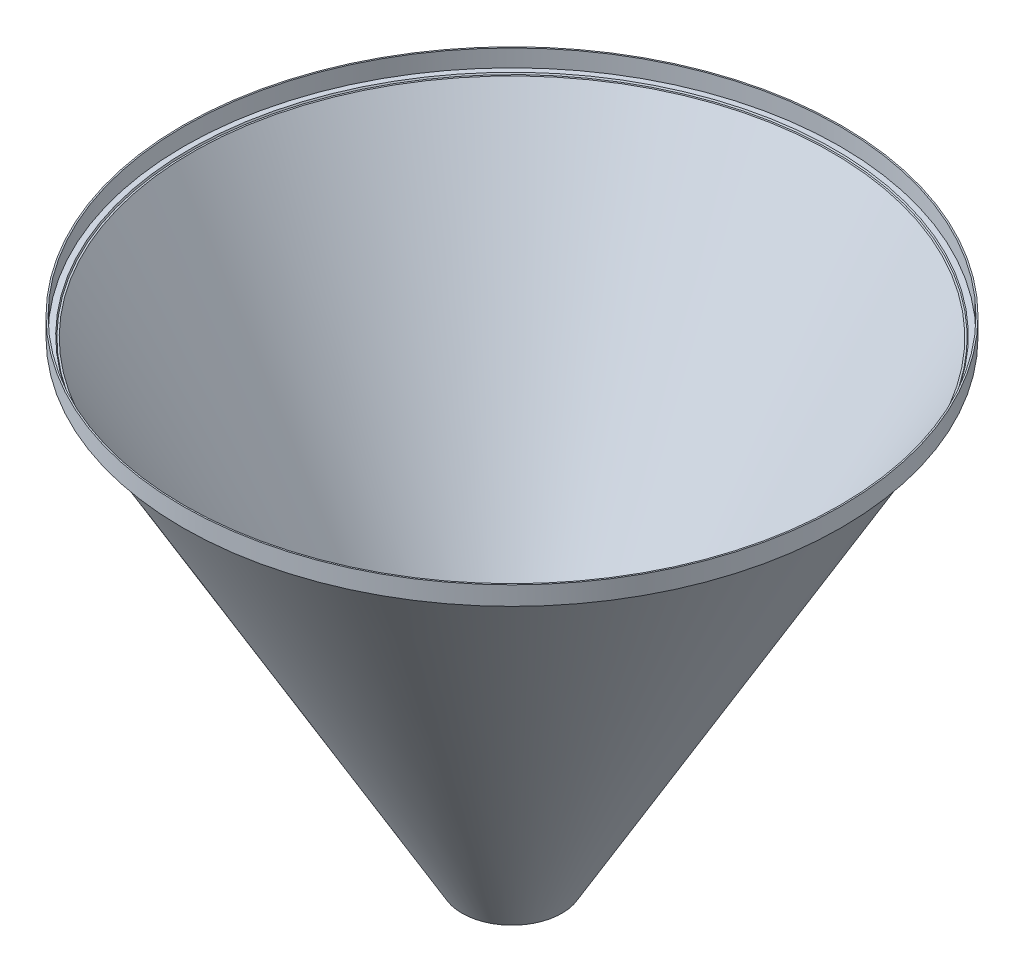
ISO-10303-21;
HEADER;
FILE_DESCRIPTION(('STEP AP214'),'2;1');
FILE_NAME('part.step','',(''),(''),'','','');
FILE_SCHEMA(('AUTOMOTIVE_DESIGN { 1 0 10303 214 1 1 1 1 }'));
ENDSEC;
DATA;
#1=APPLICATION_CONTEXT('core data for automotive mechanical design processes');
#2=APPLICATION_PROTOCOL_DEFINITION('international standard','automotive_design',2000,#1);
#3=PRODUCT_CONTEXT('',#1,'mechanical');
#4=PRODUCT('Part','Part','',(#3));
#5=PRODUCT_RELATED_PRODUCT_CATEGORY('part','',(#4));
#6=PRODUCT_DEFINITION_FORMATION('','',#4);
#7=PRODUCT_DEFINITION_CONTEXT('part definition',#1,'design');
#8=PRODUCT_DEFINITION('design','',#6,#7);
#9=PRODUCT_DEFINITION_SHAPE('','',#8);
#10=(LENGTH_UNIT() NAMED_UNIT(*) SI_UNIT(.MILLI.,.METRE.));
#11=(NAMED_UNIT(*) PLANE_ANGLE_UNIT() SI_UNIT($,.RADIAN.));
#12=(NAMED_UNIT(*) SI_UNIT($,.STERADIAN.) SOLID_ANGLE_UNIT());
#13=UNCERTAINTY_MEASURE_WITH_UNIT(LENGTH_MEASURE(1.E-05),#10,'distance_accuracy_value','');
#14=(GEOMETRIC_REPRESENTATION_CONTEXT(3) GLOBAL_UNCERTAINTY_ASSIGNED_CONTEXT((#13)) GLOBAL_UNIT_ASSIGNED_CONTEXT((#10,
#11,#12)) REPRESENTATION_CONTEXT('',''));
#15=CARTESIAN_POINT('',(0.,0.,0.));
#16=DIRECTION('',(0.,0.,1.));
#17=DIRECTION('',(1.,0.,0.));
#18=AXIS2_PLACEMENT_3D('',#15,#16,#17);
#19=CARTESIAN_POINT('',(0.,0.,0.));
#20=DIRECTION('',(0.,1.,0.));
#21=DIRECTION('',(0.,0.,1.));
#22=AXIS2_PLACEMENT_3D('',#19,#20,#21);
#23=PLANE('',#22);
#24=CARTESIAN_POINT('',(0.,0.,0.));
#25=DIRECTION('',(0.,1.,0.));
#26=DIRECTION('',(0.,0.,1.));
#27=AXIS2_PLACEMENT_3D('',#24,#25,#26);
#28=CIRCLE('',#27,34.8093235387471);
#29=CARTESIAN_POINT('',(0.,0.,34.8093235387471));
#30=VERTEX_POINT('',#29);
#31=EDGE_CURVE('E11',#30,#30,#28,.T.);
#32=ORIENTED_EDGE('',*,*,#31,.F.);
#33=EDGE_LOOP('',(#32));
#34=FACE_BOUND('',#33,.T.);
#35=CARTESIAN_POINT('',(0.,0.,0.));
#36=DIRECTION('',(0.,1.,0.));
#37=DIRECTION('',(0.,0.,1.));
#38=AXIS2_PLACEMENT_3D('',#35,#36,#37);
#39=CIRCLE('',#38,32.5);
#40=CARTESIAN_POINT('',(0.,0.,32.5));
#41=VERTEX_POINT('',#40);
#42=EDGE_CURVE('E60',#41,#41,#39,.T.);
#43=ORIENTED_EDGE('',*,*,#42,.T.);
#44=EDGE_LOOP('',(#43));
#45=FACE_BOUND('',#44,.T.);
#46=ADVANCED_FACE('F46',(#34,#45),#23,.F.);
#47=CARTESIAN_POINT('',(0.,-0.999899265021848,0.));
#48=DIRECTION('',(0.,1.,0.));
#49=DIRECTION('',(0.,0.,1.));
#50=AXIS2_PLACEMENT_3D('',#47,#48,#49);
#51=CONICAL_SURFACE('',#50,34.23210896303,0.523540617207928);
#52=CARTESIAN_POINT('',(0.,330.,0.));
#53=DIRECTION('',(0.,1.,0.));
#54=DIRECTION('',(0.,0.,1.));
#55=AXIS2_PLACEMENT_3D('',#52,#53,#54);
#56=CIRCLE('',#55,225.309323538747);
#57=CARTESIAN_POINT('',(0.,330.,225.309323538747));
#58=VERTEX_POINT('',#57);
#59=EDGE_CURVE('E55',#58,#58,#56,.T.);
#60=CARTESIAN_POINT('',(0.,330.,225.309323538747));
#61=CARTESIAN_POINT('',(0.,326.5625,223.324948538747));
#62=CARTESIAN_POINT('',(0.,323.125,221.340573538747));
#63=CARTESIAN_POINT('',(0.,316.25,217.371823538747));
#64=CARTESIAN_POINT('',(0.,312.8125,215.387448538747));
#65=CARTESIAN_POINT('',(0.,305.9375,211.418698538747));
#66=CARTESIAN_POINT('',(0.,302.5,209.434323538747));
#67=CARTESIAN_POINT('',(0.,295.625,205.465573538747));
#68=CARTESIAN_POINT('',(0.,292.1875,203.481198538747));
#69=CARTESIAN_POINT('',(0.,285.3125,199.512448538747));
#70=CARTESIAN_POINT('',(0.,281.875,197.528073538747));
#71=CARTESIAN_POINT('',(0.,275.,193.559323538747));
#72=CARTESIAN_POINT('',(0.,271.5625,191.574948538747));
#73=CARTESIAN_POINT('',(0.,264.6875,187.606198538747));
#74=CARTESIAN_POINT('',(0.,261.25,185.621823538747));
#75=CARTESIAN_POINT('',(0.,254.375,181.653073538747));
#76=CARTESIAN_POINT('',(0.,250.9375,179.668698538747));
#77=CARTESIAN_POINT('',(0.,244.0625,175.699948538747));
#78=CARTESIAN_POINT('',(0.,240.625,173.715573538747));
#79=CARTESIAN_POINT('',(0.,233.75,169.746823538747));
#80=CARTESIAN_POINT('',(0.,230.3125,167.762448538747));
#81=CARTESIAN_POINT('',(0.,223.4375,163.793698538747));
#82=CARTESIAN_POINT('',(0.,220.,161.809323538747));
#83=CARTESIAN_POINT('',(0.,213.125,157.840573538747));
#84=CARTESIAN_POINT('',(0.,209.6875,155.856198538747));
#85=CARTESIAN_POINT('',(0.,202.8125,151.887448538747));
#86=CARTESIAN_POINT('',(0.,199.375,149.903073538747));
#87=CARTESIAN_POINT('',(0.,192.5,145.934323538747));
#88=CARTESIAN_POINT('',(0.,189.0625,143.949948538747));
#89=CARTESIAN_POINT('',(0.,182.1875,139.981198538747));
#90=CARTESIAN_POINT('',(0.,178.75,137.996823538747));
#91=CARTESIAN_POINT('',(0.,171.875,134.028073538747));
#92=CARTESIAN_POINT('',(0.,168.4375,132.043698538747));
#93=CARTESIAN_POINT('',(0.,161.5625,128.074948538747));
#94=CARTESIAN_POINT('',(0.,158.125,126.090573538747));
#95=CARTESIAN_POINT('',(0.,151.25,122.121823538747));
#96=CARTESIAN_POINT('',(0.,147.8125,120.137448538747));
#97=CARTESIAN_POINT('',(0.,140.9375,116.168698538747));
#98=CARTESIAN_POINT('',(0.,137.5,114.184323538747));
#99=CARTESIAN_POINT('',(0.,130.625,110.215573538747));
#100=CARTESIAN_POINT('',(0.,127.1875,108.231198538747));
#101=CARTESIAN_POINT('',(0.,120.3125,104.262448538747));
#102=CARTESIAN_POINT('',(0.,116.875,102.278073538747));
#103=CARTESIAN_POINT('',(0.,110.,98.3093235387471));
#104=CARTESIAN_POINT('',(0.,106.5625,96.3249485387471));
#105=CARTESIAN_POINT('',(0.,99.6875,92.3561985387472));
#106=CARTESIAN_POINT('',(0.,96.25,90.3718235387471));
#107=CARTESIAN_POINT('',(0.,89.375,86.4030735387471));
#108=CARTESIAN_POINT('',(0.,85.9375,84.4186985387471));
#109=CARTESIAN_POINT('',(0.,79.0625,80.4499485387471));
#110=CARTESIAN_POINT('',(0.,75.625,78.4655735387472));
#111=CARTESIAN_POINT('',(0.,68.75,74.4968235387472));
#112=CARTESIAN_POINT('',(0.,65.3125,72.5124485387472));
#113=CARTESIAN_POINT('',(0.,58.4375,68.5436985387472));
#114=CARTESIAN_POINT('',(0.,55.,66.5593235387472));
#115=CARTESIAN_POINT('',(0.,48.125,62.5905735387472));
#116=CARTESIAN_POINT('',(0.,44.6875,60.6061985387472));
#117=CARTESIAN_POINT('',(0.,37.8125,56.6374485387471));
#118=CARTESIAN_POINT('',(0.,34.375,54.6530735387472));
#119=CARTESIAN_POINT('',(0.,27.5,50.6843235387471));
#120=CARTESIAN_POINT('',(0.,24.0625,48.6999485387471));
#121=CARTESIAN_POINT('',(0.,17.1875,44.7311985387471));
#122=CARTESIAN_POINT('',(0.,13.75,42.7468235387471));
#123=CARTESIAN_POINT('',(0.,6.87500000000002,38.7780735387471));
#124=CARTESIAN_POINT('',(0.,3.43750000000002,36.7936985387471));
#125=CARTESIAN_POINT('',(0.,0.,34.8093235387471));
#126=B_SPLINE_CURVE_WITH_KNOTS('',3,(#60,#61,#62,#63,#64,#65,#66,#67,#68,#69,#70,#71,#72,#73,
#74,#75,#76,#77,#78,#79,#80,#81,#82,#83,#84,#85,#86,#87,#88,#89,#90,#91,#92,#93,#94,#95,#96,#97,
#98,#99,#100,#101,#102,#103,#104,#105,#106,#107,#108,#109,#110,#111,#112,#113,#114,#115,#116,
#117,#118,#119,#120,#121,#122,#123,#124,#125),.UNSPECIFIED.,.F.,.F.,(4,2,2,2,2,2,2,2,2,2,2,2,2,
2,2,2,2,2,2,2,2,2,2,2,2,2,2,2,2,2,2,2,4),(0.,11.9074494966649,23.8148989933298,35.7223484899947,
47.6297979866596,59.5372474833245,71.4446969799894,83.3521464766542,95.2595959733191,
107.167045469984,119.074494966649,130.981944463314,142.889393959979,154.796843456644,
166.704292953308,178.611742449973,190.519191946638,202.426641443303,214.334090939968,
226.241540436633,238.148989933298,250.056439429963,261.963888926628,273.871338423292,
285.778787919957,297.686237416622,309.593686913287,321.501136409952,333.408585906617,
345.316035403282,357.223484899947,369.130934396612,381.038383893276),.UNSPECIFIED.);
#127=EDGE_CURVE('BSEAM48',#58,#30,#126,.T.);
#128=ORIENTED_EDGE('',*,*,#59,.F.);
#129=ORIENTED_EDGE('',*,*,#31,.T.);
#130=ORIENTED_EDGE('',*,*,#127,.T.);
#131=ORIENTED_EDGE('',*,*,#127,.F.);
#132=EDGE_LOOP('',(#128,#130,#129,#131));
#133=FACE_BOUND('',#132,.T.);
#134=ADVANCED_FACE('F48',(#133),#51,.T.);
#135=CARTESIAN_POINT('',(0.,0.,0.));
#136=DIRECTION('',(0.,1.,0.));
#137=DIRECTION('',(0.,0.,1.));
#138=AXIS2_PLACEMENT_3D('',#135,#136,#137);
#139=CONICAL_SURFACE('',#138,32.5,0.523540617207928);
#140=CARTESIAN_POINT('',(0.,330.,0.));
#141=DIRECTION('',(0.,1.,0.));
#142=DIRECTION('',(0.,0.,1.));
#143=AXIS2_PLACEMENT_3D('',#140,#141,#142);
#144=CIRCLE('',#143,223.);
#145=CARTESIAN_POINT('',(0.,330.,223.));
#146=VERTEX_POINT('',#145);
#147=EDGE_CURVE('E50',#146,#146,#144,.T.);
#148=CARTESIAN_POINT('',(0.,330.,223.));
#149=CARTESIAN_POINT('',(0.,326.5625,221.015625));
#150=CARTESIAN_POINT('',(0.,323.125,219.03125));
#151=CARTESIAN_POINT('',(0.,316.25,215.0625));
#152=CARTESIAN_POINT('',(0.,312.8125,213.078125));
#153=CARTESIAN_POINT('',(0.,305.9375,209.109375));
#154=CARTESIAN_POINT('',(0.,302.5,207.125));
#155=CARTESIAN_POINT('',(0.,295.625,203.15625));
#156=CARTESIAN_POINT('',(0.,292.1875,201.171875));
#157=CARTESIAN_POINT('',(0.,285.3125,197.203125));
#158=CARTESIAN_POINT('',(0.,281.875,195.21875));
#159=CARTESIAN_POINT('',(0.,275.,191.25));
#160=CARTESIAN_POINT('',(0.,271.5625,189.265625));
#161=CARTESIAN_POINT('',(0.,264.6875,185.296875));
#162=CARTESIAN_POINT('',(0.,261.25,183.3125));
#163=CARTESIAN_POINT('',(0.,254.375,179.34375));
#164=CARTESIAN_POINT('',(0.,250.9375,177.359375));
#165=CARTESIAN_POINT('',(0.,244.0625,173.390625));
#166=CARTESIAN_POINT('',(0.,240.625,171.40625));
#167=CARTESIAN_POINT('',(0.,233.75,167.4375));
#168=CARTESIAN_POINT('',(0.,230.3125,165.453125));
#169=CARTESIAN_POINT('',(0.,223.4375,161.484375));
#170=CARTESIAN_POINT('',(0.,220.,159.5));
#171=CARTESIAN_POINT('',(0.,213.125,155.53125));
#172=CARTESIAN_POINT('',(0.,209.6875,153.546875));
#173=CARTESIAN_POINT('',(0.,202.8125,149.578125));
#174=CARTESIAN_POINT('',(0.,199.375,147.59375));
#175=CARTESIAN_POINT('',(0.,192.5,143.625));
#176=CARTESIAN_POINT('',(0.,189.0625,141.640625));
#177=CARTESIAN_POINT('',(0.,182.1875,137.671875));
#178=CARTESIAN_POINT('',(0.,178.75,135.6875));
#179=CARTESIAN_POINT('',(0.,171.875,131.71875));
#180=CARTESIAN_POINT('',(0.,168.4375,129.734375));
#181=CARTESIAN_POINT('',(0.,161.5625,125.765625));
#182=CARTESIAN_POINT('',(0.,158.125,123.78125));
#183=CARTESIAN_POINT('',(0.,151.25,119.8125));
#184=CARTESIAN_POINT('',(0.,147.8125,117.828125));
#185=CARTESIAN_POINT('',(0.,140.9375,113.859375));
#186=CARTESIAN_POINT('',(0.,137.5,111.875));
#187=CARTESIAN_POINT('',(0.,130.625,107.90625));
#188=CARTESIAN_POINT('',(0.,127.1875,105.921875));
#189=CARTESIAN_POINT('',(0.,120.3125,101.953125));
#190=CARTESIAN_POINT('',(0.,116.875,99.96875));
#191=CARTESIAN_POINT('',(0.,110.,96.));
#192=CARTESIAN_POINT('',(0.,106.5625,94.015625));
#193=CARTESIAN_POINT('',(0.,99.6875,90.046875));
#194=CARTESIAN_POINT('',(0.,96.25,88.0625));
#195=CARTESIAN_POINT('',(0.,89.375,84.09375));
#196=CARTESIAN_POINT('',(0.,85.9375,82.109375));
#197=CARTESIAN_POINT('',(0.,79.0625,78.140625));
#198=CARTESIAN_POINT('',(0.,75.625,76.15625));
#199=CARTESIAN_POINT('',(0.,68.75,72.1875));
#200=CARTESIAN_POINT('',(0.,65.3125,70.203125));
#201=CARTESIAN_POINT('',(0.,58.4375,66.234375));
#202=CARTESIAN_POINT('',(0.,55.,64.25));
#203=CARTESIAN_POINT('',(0.,48.125,60.28125));
#204=CARTESIAN_POINT('',(0.,44.6875,58.296875));
#205=CARTESIAN_POINT('',(0.,37.8125,54.328125));
#206=CARTESIAN_POINT('',(0.,34.375,52.34375));
#207=CARTESIAN_POINT('',(0.,27.5,48.375));
#208=CARTESIAN_POINT('',(0.,24.0625,46.390625));
#209=CARTESIAN_POINT('',(0.,17.1875,42.421875));
#210=CARTESIAN_POINT('',(0.,13.75,40.4375));
#211=CARTESIAN_POINT('',(0.,6.875,36.46875));
#212=CARTESIAN_POINT('',(0.,3.4375,34.484375));
#213=CARTESIAN_POINT('',(0.,0.,32.5));
#214=B_SPLINE_CURVE_WITH_KNOTS('',3,(#148,#149,#150,#151,#152,#153,#154,#155,#156,#157,#158,
#159,#160,#161,#162,#163,#164,#165,#166,#167,#168,#169,#170,#171,#172,#173,#174,#175,#176,#177,
#178,#179,#180,#181,#182,#183,#184,#185,#186,#187,#188,#189,#190,#191,#192,#193,#194,#195,#196,
#197,#198,#199,#200,#201,#202,#203,#204,#205,#206,#207,#208,#209,#210,#211,#212,#213),
.UNSPECIFIED.,.F.,.F.,(4,2,2,2,2,2,2,2,2,2,2,2,2,2,2,2,2,2,2,2,2,2,2,2,2,2,2,2,2,2,2,2,4),(0.,
11.9074494966649,23.8148989933298,35.7223484899947,47.6297979866596,59.5372474833245,
71.4446969799894,83.3521464766542,95.2595959733191,107.167045469984,119.074494966649,
130.981944463314,142.889393959979,154.796843456644,166.704292953308,178.611742449973,
190.519191946638,202.426641443303,214.334090939968,226.241540436633,238.148989933298,
250.056439429963,261.963888926628,273.871338423292,285.778787919957,297.686237416622,
309.593686913287,321.501136409952,333.408585906617,345.316035403282,357.223484899947,
369.130934396612,381.038383893276),.UNSPECIFIED.);
#215=EDGE_CURVE('BSEAM78',#146,#41,#214,.T.);
#216=ORIENTED_EDGE('',*,*,#147,.T.);
#217=ORIENTED_EDGE('',*,*,#42,.F.);
#218=ORIENTED_EDGE('',*,*,#215,.T.);
#219=ORIENTED_EDGE('',*,*,#215,.F.);
#220=EDGE_LOOP('',(#216,#218,#217,#219));
#221=FACE_BOUND('',#220,.T.);
#222=ADVANCED_FACE('F78',(#221),#139,.F.);
#223=CARTESIAN_POINT('',(0.,330.,0.));
#224=DIRECTION('',(0.,1.,0.));
#225=DIRECTION('',(0.,0.,1.));
#226=AXIS2_PLACEMENT_3D('',#223,#224,#225);
#227=PLANE('',#226);
#228=ORIENTED_EDGE('',*,*,#59,.T.);
#229=EDGE_LOOP('',(#228));
#230=FACE_BOUND('',#229,.T.);
#231=CARTESIAN_POINT('',(0.,330.,0.));
#232=DIRECTION('',(0.,1.,0.));
#233=DIRECTION('',(0.,0.,1.));
#234=AXIS2_PLACEMENT_3D('',#231,#232,#233);
#235=CIRCLE('',#234,229.5);
#236=CARTESIAN_POINT('',(0.,330.,-229.5));
#237=VERTEX_POINT('',#236);
#238=EDGE_CURVE('E105',#237,#237,#235,.T.);
#239=ORIENTED_EDGE('',*,*,#238,.F.);
#240=EDGE_LOOP('',(#239));
#241=FACE_BOUND('',#240,.T.);
#242=ADVANCED_FACE('F82',(#230,#241),#227,.F.);
#243=CARTESIAN_POINT('',(0.,343.,0.));
#244=DIRECTION('',(0.,1.,0.));
#245=DIRECTION('',(0.,0.,1.));
#246=AXIS2_PLACEMENT_3D('',#243,#244,#245);
#247=PLANE('',#246);
#248=CARTESIAN_POINT('',(0.,343.,0.));
#249=DIRECTION('',(0.,1.,0.));
#250=DIRECTION('',(0.,0.,1.));
#251=AXIS2_PLACEMENT_3D('',#248,#249,#250);
#252=CIRCLE('',#251,228.5);
#253=CARTESIAN_POINT('',(0.,343.,-228.5));
#254=VERTEX_POINT('',#253);
#255=EDGE_CURVE('E127',#254,#254,#252,.T.);
#256=ORIENTED_EDGE('',*,*,#255,.F.);
#257=EDGE_LOOP('',(#256));
#258=FACE_BOUND('',#257,.T.);
#259=CARTESIAN_POINT('',(0.,343.,0.));
#260=DIRECTION('',(0.,1.,0.));
#261=DIRECTION('',(0.,0.,1.));
#262=AXIS2_PLACEMENT_3D('',#259,#260,#261);
#263=CIRCLE('',#262,229.5);
#264=CARTESIAN_POINT('',(0.,343.,-229.5));
#265=VERTEX_POINT('',#264);
#266=EDGE_CURVE('E102',#265,#265,#263,.T.);
#267=ORIENTED_EDGE('',*,*,#266,.T.);
#268=EDGE_LOOP('',(#267));
#269=FACE_BOUND('',#268,.T.);
#270=ADVANCED_FACE('F139',(#258,#269),#247,.T.);
#271=CARTESIAN_POINT('',(0.,343.,0.));
#272=DIRECTION('',(0.,-1.,0.));
#273=DIRECTION('',(0.,0.,-1.));
#274=AXIS2_PLACEMENT_3D('',#271,#272,#273);
#275=CYLINDRICAL_SURFACE('',#274,229.5);
#276=CARTESIAN_POINT('',(0.,343.,-229.5));
#277=CARTESIAN_POINT('',(0.,342.864583333333,-229.5));
#278=CARTESIAN_POINT('',(0.,342.729166666667,-229.5));
#279=CARTESIAN_POINT('',(0.,342.458333333333,-229.5));
#280=CARTESIAN_POINT('',(0.,342.322916666667,-229.5));
#281=CARTESIAN_POINT('',(0.,342.052083333333,-229.5));
#282=CARTESIAN_POINT('',(0.,341.916666666667,-229.5));
#283=CARTESIAN_POINT('',(0.,341.645833333333,-229.5));
#284=CARTESIAN_POINT('',(0.,341.510416666667,-229.5));
#285=CARTESIAN_POINT('',(0.,341.239583333333,-229.5));
#286=CARTESIAN_POINT('',(0.,341.104166666667,-229.5));
#287=CARTESIAN_POINT('',(0.,340.833333333333,-229.5));
#288=CARTESIAN_POINT('',(0.,340.697916666667,-229.5));
#289=CARTESIAN_POINT('',(0.,340.427083333333,-229.5));
#290=CARTESIAN_POINT('',(0.,340.291666666667,-229.5));
#291=CARTESIAN_POINT('',(0.,340.020833333333,-229.5));
#292=CARTESIAN_POINT('',(0.,339.885416666667,-229.5));
#293=CARTESIAN_POINT('',(0.,339.614583333333,-229.5));
#294=CARTESIAN_POINT('',(0.,339.479166666667,-229.5));
#295=CARTESIAN_POINT('',(0.,339.208333333333,-229.5));
#296=CARTESIAN_POINT('',(0.,339.072916666667,-229.5));
#297=CARTESIAN_POINT('',(0.,338.802083333333,-229.5));
#298=CARTESIAN_POINT('',(0.,338.666666666667,-229.5));
#299=CARTESIAN_POINT('',(0.,338.395833333333,-229.5));
#300=CARTESIAN_POINT('',(0.,338.260416666667,-229.5));
#301=CARTESIAN_POINT('',(0.,337.989583333333,-229.5));
#302=CARTESIAN_POINT('',(0.,337.854166666667,-229.5));
#303=CARTESIAN_POINT('',(0.,337.583333333333,-229.5));
#304=CARTESIAN_POINT('',(0.,337.447916666667,-229.5));
#305=CARTESIAN_POINT('',(0.,337.177083333333,-229.5));
#306=CARTESIAN_POINT('',(0.,337.041666666667,-229.5));
#307=CARTESIAN_POINT('',(0.,336.770833333333,-229.5));
#308=CARTESIAN_POINT('',(0.,336.635416666667,-229.5));
#309=CARTESIAN_POINT('',(0.,336.364583333333,-229.5));
#310=CARTESIAN_POINT('',(0.,336.229166666667,-229.5));
#311=CARTESIAN_POINT('',(0.,335.958333333333,-229.5));
#312=CARTESIAN_POINT('',(0.,335.822916666667,-229.5));
#313=CARTESIAN_POINT('',(0.,335.552083333333,-229.5));
#314=CARTESIAN_POINT('',(0.,335.416666666667,-229.5));
#315=CARTESIAN_POINT('',(0.,335.145833333333,-229.5));
#316=CARTESIAN_POINT('',(0.,335.010416666667,-229.5));
#317=CARTESIAN_POINT('',(0.,334.739583333333,-229.5));
#318=CARTESIAN_POINT('',(0.,334.604166666667,-229.5));
#319=CARTESIAN_POINT('',(0.,334.333333333333,-229.5));
#320=CARTESIAN_POINT('',(0.,334.197916666667,-229.5));
#321=CARTESIAN_POINT('',(0.,333.927083333333,-229.5));
#322=CARTESIAN_POINT('',(0.,333.791666666667,-229.5));
#323=CARTESIAN_POINT('',(0.,333.520833333333,-229.5));
#324=CARTESIAN_POINT('',(0.,333.385416666667,-229.5));
#325=CARTESIAN_POINT('',(0.,333.114583333333,-229.5));
#326=CARTESIAN_POINT('',(0.,332.979166666667,-229.5));
#327=CARTESIAN_POINT('',(0.,332.708333333333,-229.5));
#328=CARTESIAN_POINT('',(0.,332.572916666667,-229.5));
#329=CARTESIAN_POINT('',(0.,332.302083333333,-229.5));
#330=CARTESIAN_POINT('',(0.,332.166666666667,-229.5));
#331=CARTESIAN_POINT('',(0.,331.895833333333,-229.5));
#332=CARTESIAN_POINT('',(0.,331.760416666667,-229.5));
#333=CARTESIAN_POINT('',(0.,331.489583333333,-229.5));
#334=CARTESIAN_POINT('',(0.,331.354166666667,-229.5));
#335=CARTESIAN_POINT('',(0.,331.083333333333,-229.5));
#336=CARTESIAN_POINT('',(0.,330.947916666667,-229.5));
#337=CARTESIAN_POINT('',(0.,330.677083333333,-229.5));
#338=CARTESIAN_POINT('',(0.,330.541666666667,-229.5));
#339=CARTESIAN_POINT('',(0.,330.270833333333,-229.5));
#340=CARTESIAN_POINT('',(0.,330.135416666667,-229.5));
#341=CARTESIAN_POINT('',(0.,330.,-229.5));
#342=B_SPLINE_CURVE_WITH_KNOTS('',3,(#276,#277,#278,#279,#280,#281,#282,#283,#284,#285,#286,
#287,#288,#289,#290,#291,#292,#293,#294,#295,#296,#297,#298,#299,#300,#301,#302,#303,#304,#305,
#306,#307,#308,#309,#310,#311,#312,#313,#314,#315,#316,#317,#318,#319,#320,#321,#322,#323,#324,
#325,#326,#327,#328,#329,#330,#331,#332,#333,#334,#335,#336,#337,#338,#339,#340,#341),
.UNSPECIFIED.,.F.,.F.,(4,2,2,2,2,2,2,2,2,2,2,2,2,2,2,2,2,2,2,2,2,2,2,2,2,2,2,2,2,2,2,2,4),(0.,
0.406249999999997,0.812499999999994,1.21874999999999,1.62499999999999,2.03124999999998,
2.43749999999998,2.84374999999998,3.24999999999998,3.65624999999997,4.06249999999997,
4.46874999999997,4.87499999999996,5.28124999999996,5.68749999999996,6.09374999999995,
6.49999999999995,6.90625,7.3125,7.71875,8.12499999999999,8.53124999999999,8.93749999999999,
9.34374999999998,9.74999999999998,10.15625,10.5625,10.96875,11.375,11.78125,12.1875,12.59375,
13.),.UNSPECIFIED.);
#343=EDGE_CURVE('BSEAM84',#265,#237,#342,.T.);
#344=ORIENTED_EDGE('',*,*,#266,.F.);
#345=ORIENTED_EDGE('',*,*,#238,.T.);
#346=ORIENTED_EDGE('',*,*,#343,.T.);
#347=ORIENTED_EDGE('',*,*,#343,.F.);
#348=EDGE_LOOP('',(#344,#346,#345,#347));
#349=FACE_BOUND('',#348,.T.);
#350=ADVANCED_FACE('F84',(#349),#275,.T.);
#351=CARTESIAN_POINT('',(0.,330.,0.));
#352=DIRECTION('',(0.,1.,0.));
#353=DIRECTION('',(0.,0.,1.));
#354=AXIS2_PLACEMENT_3D('',#351,#352,#353);
#355=PLANE('',#354);
#356=CARTESIAN_POINT('',(0.,330.,0.));
#357=DIRECTION('',(0.,1.,0.));
#358=DIRECTION('',(0.,0.,1.));
#359=AXIS2_PLACEMENT_3D('',#356,#357,#358);
#360=CIRCLE('',#359,224.154661769374);
#361=CARTESIAN_POINT('',(0.,330.,224.154661769374));
#362=VERTEX_POINT('',#361);
#363=EDGE_CURVE('E122',#362,#362,#360,.T.);
#364=ORIENTED_EDGE('',*,*,#363,.T.);
#365=EDGE_LOOP('',(#364));
#366=FACE_BOUND('',#365,.T.);
#367=ORIENTED_EDGE('',*,*,#147,.F.);
#368=EDGE_LOOP('',(#367));
#369=FACE_BOUND('',#368,.T.);
#370=ADVANCED_FACE('F146',(#366,#369),#355,.T.);
#371=CARTESIAN_POINT('',(0.,-0.499949632510924,0.));
#372=DIRECTION('',(0.,1.,0.));
#373=DIRECTION('',(0.,0.,1.));
#374=AXIS2_PLACEMENT_3D('',#371,#372,#373);
#375=CONICAL_SURFACE('',#374,33.366054481515,0.523540617207928);
#376=CARTESIAN_POINT('',(0.,331.,0.));
#377=DIRECTION('',(0.,1.,0.));
#378=DIRECTION('',(0.,0.,1.));
#379=AXIS2_PLACEMENT_3D('',#376,#377,#378);
#380=CIRCLE('',#379,224.731934496646);
#381=CARTESIAN_POINT('',(0.,331.,224.731934496646));
#382=VERTEX_POINT('',#381);
#383=EDGE_CURVE('E120',#382,#382,#380,.T.);
#384=ORIENTED_EDGE('',*,*,#383,.T.);
#385=EDGE_LOOP('',(#384));
#386=FACE_BOUND('',#385,.T.);
#387=ORIENTED_EDGE('',*,*,#363,.F.);
#388=EDGE_LOOP('',(#387));
#389=FACE_BOUND('',#388,.T.);
#390=ADVANCED_FACE('F155',(#386,#389),#375,.F.);
#391=CARTESIAN_POINT('',(0.,331.,0.));
#392=DIRECTION('',(0.,1.,0.));
#393=DIRECTION('',(0.,0.,1.));
#394=AXIS2_PLACEMENT_3D('',#391,#392,#393);
#395=PLANE('',#394);
#396=ORIENTED_EDGE('',*,*,#383,.F.);
#397=EDGE_LOOP('',(#396));
#398=FACE_BOUND('',#397,.T.);
#399=CARTESIAN_POINT('',(0.,331.,0.));
#400=DIRECTION('',(0.,1.,0.));
#401=DIRECTION('',(0.,0.,1.));
#402=AXIS2_PLACEMENT_3D('',#399,#400,#401);
#403=CIRCLE('',#402,228.5);
#404=CARTESIAN_POINT('',(0.,331.,-228.5));
#405=VERTEX_POINT('',#404);
#406=EDGE_CURVE('E130',#405,#405,#403,.T.);
#407=ORIENTED_EDGE('',*,*,#406,.T.);
#408=EDGE_LOOP('',(#407));
#409=FACE_BOUND('',#408,.T.);
#410=ADVANCED_FACE('F152',(#398,#409),#395,.T.);
#411=CARTESIAN_POINT('',(0.,343.,0.));
#412=DIRECTION('',(0.,-1.,0.));
#413=DIRECTION('',(0.,0.,-1.));
#414=AXIS2_PLACEMENT_3D('',#411,#412,#413);
#415=CYLINDRICAL_SURFACE('',#414,228.5);
#416=CARTESIAN_POINT('',(0.,343.,-228.5));
#417=CARTESIAN_POINT('',(0.,342.875,-228.5));
#418=CARTESIAN_POINT('',(0.,342.75,-228.5));
#419=CARTESIAN_POINT('',(0.,342.5,-228.5));
#420=CARTESIAN_POINT('',(0.,342.375,-228.5));
#421=CARTESIAN_POINT('',(0.,342.125,-228.5));
#422=CARTESIAN_POINT('',(0.,342.,-228.5));
#423=CARTESIAN_POINT('',(0.,341.75,-228.5));
#424=CARTESIAN_POINT('',(0.,341.625,-228.5));
#425=CARTESIAN_POINT('',(0.,341.375,-228.5));
#426=CARTESIAN_POINT('',(0.,341.25,-228.5));
#427=CARTESIAN_POINT('',(0.,341.,-228.5));
#428=CARTESIAN_POINT('',(0.,340.875,-228.5));
#429=CARTESIAN_POINT('',(0.,340.625,-228.5));
#430=CARTESIAN_POINT('',(0.,340.5,-228.5));
#431=CARTESIAN_POINT('',(0.,340.25,-228.5));
#432=CARTESIAN_POINT('',(0.,340.125,-228.5));
#433=CARTESIAN_POINT('',(0.,339.875,-228.5));
#434=CARTESIAN_POINT('',(0.,339.75,-228.5));
#435=CARTESIAN_POINT('',(0.,339.5,-228.5));
#436=CARTESIAN_POINT('',(0.,339.375,-228.5));
#437=CARTESIAN_POINT('',(0.,339.125,-228.5));
#438=CARTESIAN_POINT('',(0.,339.,-228.5));
#439=CARTESIAN_POINT('',(0.,338.75,-228.5));
#440=CARTESIAN_POINT('',(0.,338.625,-228.5));
#441=CARTESIAN_POINT('',(0.,338.375,-228.5));
#442=CARTESIAN_POINT('',(0.,338.25,-228.5));
#443=CARTESIAN_POINT('',(0.,338.,-228.5));
#444=CARTESIAN_POINT('',(0.,337.875,-228.5));
#445=CARTESIAN_POINT('',(0.,337.625,-228.5));
#446=CARTESIAN_POINT('',(0.,337.5,-228.5));
#447=CARTESIAN_POINT('',(0.,337.25,-228.5));
#448=CARTESIAN_POINT('',(0.,337.125,-228.5));
#449=CARTESIAN_POINT('',(0.,336.875,-228.5));
#450=CARTESIAN_POINT('',(0.,336.75,-228.5));
#451=CARTESIAN_POINT('',(0.,336.5,-228.5));
#452=CARTESIAN_POINT('',(0.,336.375,-228.5));
#453=CARTESIAN_POINT('',(0.,336.125,-228.5));
#454=CARTESIAN_POINT('',(0.,336.,-228.5));
#455=CARTESIAN_POINT('',(0.,335.75,-228.5));
#456=CARTESIAN_POINT('',(0.,335.625,-228.5));
#457=CARTESIAN_POINT('',(0.,335.375,-228.5));
#458=CARTESIAN_POINT('',(0.,335.25,-228.5));
#459=CARTESIAN_POINT('',(0.,335.,-228.5));
#460=CARTESIAN_POINT('',(0.,334.875,-228.5));
#461=CARTESIAN_POINT('',(0.,334.625,-228.5));
#462=CARTESIAN_POINT('',(0.,334.5,-228.5));
#463=CARTESIAN_POINT('',(0.,334.25,-228.5));
#464=CARTESIAN_POINT('',(0.,334.125,-228.5));
#465=CARTESIAN_POINT('',(0.,333.875,-228.5));
#466=CARTESIAN_POINT('',(0.,333.75,-228.5));
#467=CARTESIAN_POINT('',(0.,333.5,-228.5));
#468=CARTESIAN_POINT('',(0.,333.375,-228.5));
#469=CARTESIAN_POINT('',(0.,333.125,-228.5));
#470=CARTESIAN_POINT('',(0.,333.,-228.5));
#471=CARTESIAN_POINT('',(0.,332.75,-228.5));
#472=CARTESIAN_POINT('',(0.,332.625,-228.5));
#473=CARTESIAN_POINT('',(0.,332.375,-228.5));
#474=CARTESIAN_POINT('',(0.,332.25,-228.5));
#475=CARTESIAN_POINT('',(0.,332.,-228.5));
#476=CARTESIAN_POINT('',(0.,331.875,-228.5));
#477=CARTESIAN_POINT('',(0.,331.625,-228.5));
#478=CARTESIAN_POINT('',(0.,331.5,-228.5));
#479=CARTESIAN_POINT('',(0.,331.25,-228.5));
#480=CARTESIAN_POINT('',(0.,331.125,-228.5));
#481=CARTESIAN_POINT('',(0.,331.,-228.5));
#482=B_SPLINE_CURVE_WITH_KNOTS('',3,(#416,#417,#418,#419,#420,#421,#422,#423,#424,#425,#426,
#427,#428,#429,#430,#431,#432,#433,#434,#435,#436,#437,#438,#439,#440,#441,#442,#443,#444,#445,
#446,#447,#448,#449,#450,#451,#452,#453,#454,#455,#456,#457,#458,#459,#460,#461,#462,#463,#464,
#465,#466,#467,#468,#469,#470,#471,#472,#473,#474,#475,#476,#477,#478,#479,#480,#481),
.UNSPECIFIED.,.F.,.F.,(4,2,2,2,2,2,2,2,2,2,2,2,2,2,2,2,2,2,2,2,2,2,2,2,2,2,2,2,2,2,2,2,4),(0.,
0.374999999999959,0.749999999999973,1.12499999999999,1.49999999999995,1.87499999999996,
2.24999999999997,2.62499999999999,2.99999999999995,3.37499999999996,3.74999999999998,
4.12499999999999,4.49999999999995,4.87499999999996,5.24999999999998,5.62499999999999,
5.99999999999995,6.37499999999996,6.74999999999998,7.12499999999999,7.49999999999995,
7.87499999999997,8.24999999999998,8.62499999999999,8.99999999999995,9.37499999999997,
9.74999999999998,10.125,10.5,10.875,11.25,11.625,12.),.UNSPECIFIED.);
#483=EDGE_CURVE('BSEAM136',#254,#405,#482,.T.);
#484=ORIENTED_EDGE('',*,*,#255,.T.);
#485=ORIENTED_EDGE('',*,*,#406,.F.);
#486=ORIENTED_EDGE('',*,*,#483,.T.);
#487=ORIENTED_EDGE('',*,*,#483,.F.);
#488=EDGE_LOOP('',(#484,#486,#485,#487));
#489=FACE_BOUND('',#488,.T.);
#490=ADVANCED_FACE('F136',(#489),#415,.F.);
#491=CLOSED_SHELL('',(#46,#134,#222,#242,#270,#350,#370,#390,#410,#490));
#492=MANIFOLD_SOLID_BREP('B2',#491);
#493=ADVANCED_BREP_SHAPE_REPRESENTATION('',(#18,#492),#14);
#494=SHAPE_DEFINITION_REPRESENTATION(#9,#493);
ENDSEC;
END-ISO-10303-21;
